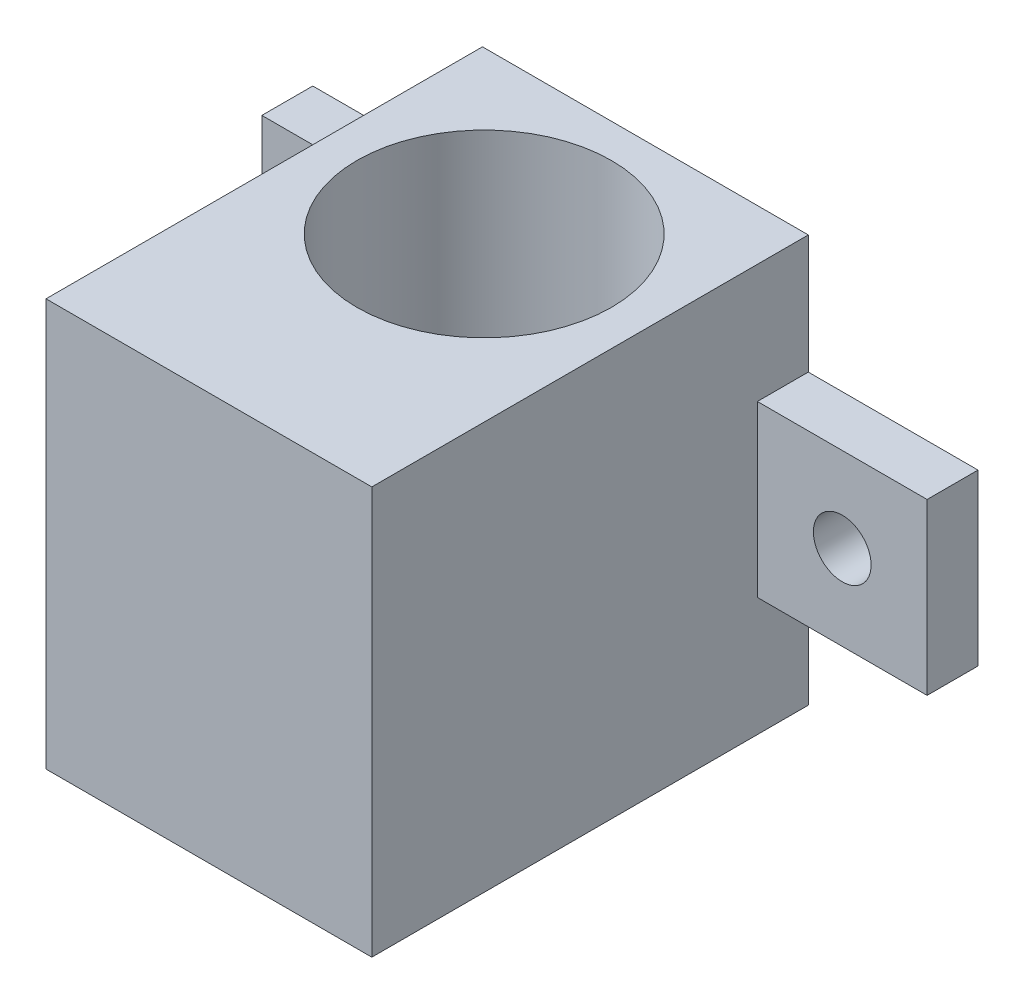
ISO-10303-21;
HEADER;
FILE_DESCRIPTION(('STEP AP214'),'2;1');
FILE_NAME('part.step','',(''),(''),'','','');
FILE_SCHEMA(('AUTOMOTIVE_DESIGN { 1 0 10303 214 1 1 1 1 }'));
ENDSEC;
DATA;
#1=APPLICATION_CONTEXT('core data for automotive mechanical design processes');
#2=APPLICATION_PROTOCOL_DEFINITION('international standard','automotive_design',2000,#1);
#3=PRODUCT_CONTEXT('',#1,'mechanical');
#4=PRODUCT('Part','Part','',(#3));
#5=PRODUCT_RELATED_PRODUCT_CATEGORY('part','',(#4));
#6=PRODUCT_DEFINITION_FORMATION('','',#4);
#7=PRODUCT_DEFINITION_CONTEXT('part definition',#1,'design');
#8=PRODUCT_DEFINITION('design','',#6,#7);
#9=PRODUCT_DEFINITION_SHAPE('','',#8);
#10=(LENGTH_UNIT() NAMED_UNIT(*) SI_UNIT(.MILLI.,.METRE.));
#11=(NAMED_UNIT(*) PLANE_ANGLE_UNIT() SI_UNIT($,.RADIAN.));
#12=(NAMED_UNIT(*) SI_UNIT($,.STERADIAN.) SOLID_ANGLE_UNIT());
#13=UNCERTAINTY_MEASURE_WITH_UNIT(LENGTH_MEASURE(1.E-05),#10,'distance_accuracy_value','');
#14=(GEOMETRIC_REPRESENTATION_CONTEXT(3) GLOBAL_UNCERTAINTY_ASSIGNED_CONTEXT((#13)) GLOBAL_UNIT_ASSIGNED_CONTEXT((#10,
#11,#12)) REPRESENTATION_CONTEXT('',''));
#15=CARTESIAN_POINT('',(0.,0.,0.));
#16=DIRECTION('',(0.,0.,1.));
#17=DIRECTION('',(1.,0.,0.));
#18=AXIS2_PLACEMENT_3D('',#15,#16,#17);
#19=CARTESIAN_POINT('',(0.,0.,3000.00000000004));
#20=DIRECTION('',(0.,0.,-1.));
#21=DIRECTION('',(-1.,0.,0.));
#22=AXIS2_PLACEMENT_3D('',#19,#20,#21);
#23=PLANE('',#22);
#24=CARTESIAN_POINT('',(14600.,0.,3000.00000000004));
#25=DIRECTION('',(0.,0.,1.));
#26=DIRECTION('',(1.,0.,0.));
#27=AXIS2_PLACEMENT_3D('',#24,#25,#26);
#28=CIRCLE('',#27,1700.);
#29=CARTESIAN_POINT('',(16300.,0.,3000.00000000004));
#30=VERTEX_POINT('',#29);
#31=EDGE_CURVE('E314',#30,#30,#28,.T.);
#32=ORIENTED_EDGE('',*,*,#31,.F.);
#33=EDGE_LOOP('',(#32));
#34=FACE_BOUND('',#33,.T.);
#35=DIRECTION('',(0.,1.,0.));
#36=VECTOR('',#35,1.);
#37=CARTESIAN_POINT('',(9600.,-12000.,3000.00000000004));
#38=LINE('',#37,#36);
#39=CARTESIAN_POINT('',(9600.,-5000.,3000.00000000004));
#40=VERTEX_POINT('',#39);
#41=CARTESIAN_POINT('',(9600.,5000.,3000.00000000004));
#42=VERTEX_POINT('',#41);
#43=EDGE_CURVE('E11',#40,#42,#38,.T.);
#44=ORIENTED_EDGE('',*,*,#43,.F.);
#45=DIRECTION('',(1.,0.,0.));
#46=VECTOR('',#45,1.);
#47=CARTESIAN_POINT('',(19600.,-5000.,3000.00000000004));
#48=LINE('',#47,#46);
#49=CARTESIAN_POINT('',(19600.,-5000.,3000.00000000004));
#50=VERTEX_POINT('',#49);
#51=EDGE_CURVE('E159',#40,#50,#48,.T.);
#52=ORIENTED_EDGE('',*,*,#51,.T.);
#53=DIRECTION('',(0.,1.,0.));
#54=VECTOR('',#53,1.);
#55=CARTESIAN_POINT('',(19600.,5000.,3000.00000000004));
#56=LINE('',#55,#54);
#57=CARTESIAN_POINT('',(19600.,5000.,3000.00000000004));
#58=VERTEX_POINT('',#57);
#59=EDGE_CURVE('E131',#50,#58,#56,.T.);
#60=ORIENTED_EDGE('',*,*,#59,.T.);
#61=DIRECTION('',(-1.,0.,0.));
#62=VECTOR('',#61,1.);
#63=CARTESIAN_POINT('',(9600.,5000.,3000.00000000004));
#64=LINE('',#63,#62);
#65=EDGE_CURVE('E127',#58,#42,#64,.T.);
#66=ORIENTED_EDGE('',*,*,#65,.T.);
#67=EDGE_LOOP('',(#44,#52,#60,#66));
#68=FACE_BOUND('',#67,.T.);
#69=ADVANCED_FACE('F35',(#34,#68),#23,.F.);
#70=CARTESIAN_POINT('',(-14600.,0.,3000.00000000004));
#71=DIRECTION('',(0.,0.,1.));
#72=DIRECTION('',(1.,0.,0.));
#73=AXIS2_PLACEMENT_3D('',#70,#71,#72);
#74=CIRCLE('',#73,1700.);
#75=CARTESIAN_POINT('',(-12900.,0.,3000.00000000004));
#76=VERTEX_POINT('',#75);
#77=EDGE_CURVE('E249',#76,#76,#74,.T.);
#78=ORIENTED_EDGE('',*,*,#77,.F.);
#79=EDGE_LOOP('',(#78));
#80=FACE_BOUND('',#79,.T.);
#81=DIRECTION('',(0.,-1.,0.));
#82=VECTOR('',#81,1.);
#83=CARTESIAN_POINT('',(-9600.,-12000.,3000.00000000004));
#84=LINE('',#83,#82);
#85=CARTESIAN_POINT('',(-9600.,5000.,3000.00000000004));
#86=VERTEX_POINT('',#85);
#87=CARTESIAN_POINT('',(-9600.,-5000.,3000.00000000004));
#88=VERTEX_POINT('',#87);
#89=EDGE_CURVE('E45',#86,#88,#84,.T.);
#90=ORIENTED_EDGE('',*,*,#89,.F.);
#91=DIRECTION('',(-1.,0.,0.));
#92=VECTOR('',#91,1.);
#93=CARTESIAN_POINT('',(-19600.,5000.,3000.00000000004));
#94=LINE('',#93,#92);
#95=CARTESIAN_POINT('',(-19600.,5000.,3000.00000000004));
#96=VERTEX_POINT('',#95);
#97=EDGE_CURVE('E54',#86,#96,#94,.T.);
#98=ORIENTED_EDGE('',*,*,#97,.T.);
#99=DIRECTION('',(0.,-1.,0.));
#100=VECTOR('',#99,1.);
#101=CARTESIAN_POINT('',(-19600.,-5000.,3000.00000000004));
#102=LINE('',#101,#100);
#103=CARTESIAN_POINT('',(-19600.,-5000.,3000.00000000004));
#104=VERTEX_POINT('',#103);
#105=EDGE_CURVE('E163',#96,#104,#102,.T.);
#106=ORIENTED_EDGE('',*,*,#105,.T.);
#107=DIRECTION('',(1.,0.,0.));
#108=VECTOR('',#107,1.);
#109=CARTESIAN_POINT('',(-9600.,-5000.,3000.00000000004));
#110=LINE('',#109,#108);
#111=EDGE_CURVE('E111',#104,#88,#110,.T.);
#112=ORIENTED_EDGE('',*,*,#111,.T.);
#113=EDGE_LOOP('',(#90,#98,#106,#112));
#114=FACE_BOUND('',#113,.T.);
#115=ADVANCED_FACE('F252',(#80,#114),#23,.F.);
#116=CARTESIAN_POINT('',(0.,0.,0.));
#117=DIRECTION('',(0.,0.,-1.));
#118=DIRECTION('',(-1.,0.,0.));
#119=AXIS2_PLACEMENT_3D('',#116,#117,#118);
#120=PLANE('',#119);
#121=CARTESIAN_POINT('',(-14600.,0.,0.));
#122=DIRECTION('',(0.,0.,1.));
#123=DIRECTION('',(1.,0.,0.));
#124=AXIS2_PLACEMENT_3D('',#121,#122,#123);
#125=CIRCLE('',#124,1700.);
#126=CARTESIAN_POINT('',(-12900.,0.,0.));
#127=VERTEX_POINT('',#126);
#128=EDGE_CURVE('E245',#127,#127,#125,.T.);
#129=ORIENTED_EDGE('',*,*,#128,.T.);
#130=EDGE_LOOP('',(#129));
#131=FACE_BOUND('',#130,.T.);
#132=DIRECTION('',(0.,-1.,0.));
#133=VECTOR('',#132,1.);
#134=CARTESIAN_POINT('',(-19600.,-5000.,0.));
#135=LINE('',#134,#133);
#136=CARTESIAN_POINT('',(-19600.,5000.,0.));
#137=VERTEX_POINT('',#136);
#138=CARTESIAN_POINT('',(-19600.,-5000.,0.));
#139=VERTEX_POINT('',#138);
#140=EDGE_CURVE('E248',#137,#139,#135,.T.);
#141=ORIENTED_EDGE('',*,*,#140,.F.);
#142=DIRECTION('',(-1.,0.,0.));
#143=VECTOR('',#142,1.);
#144=CARTESIAN_POINT('',(-19600.,5000.,0.));
#145=LINE('',#144,#143);
#146=CARTESIAN_POINT('',(-9600.,5000.,0.));
#147=VERTEX_POINT('',#146);
#148=EDGE_CURVE('E102',#147,#137,#145,.T.);
#149=ORIENTED_EDGE('',*,*,#148,.F.);
#150=DIRECTION('',(0.,-1.,0.));
#151=VECTOR('',#150,1.);
#152=CARTESIAN_POINT('',(-9600.,5000.,0.));
#153=LINE('',#152,#151);
#154=CARTESIAN_POINT('',(-9600.,12000.,0.));
#155=VERTEX_POINT('',#154);
#156=EDGE_CURVE('E96',#155,#147,#153,.T.);
#157=ORIENTED_EDGE('',*,*,#156,.F.);
#158=DIRECTION('',(-1.,0.,0.));
#159=VECTOR('',#158,1.);
#160=CARTESIAN_POINT('',(-9600.,12000.,0.));
#161=LINE('',#160,#159);
#162=CARTESIAN_POINT('',(9600.,12000.,0.));
#163=VERTEX_POINT('',#162);
#164=EDGE_CURVE('E241',#163,#155,#161,.T.);
#165=ORIENTED_EDGE('',*,*,#164,.F.);
#166=DIRECTION('',(0.,1.,0.));
#167=VECTOR('',#166,1.);
#168=CARTESIAN_POINT('',(9600.,12000.,0.));
#169=LINE('',#168,#167);
#170=CARTESIAN_POINT('',(9600.,5000.,0.));
#171=VERTEX_POINT('',#170);
#172=EDGE_CURVE('E239',#171,#163,#169,.T.);
#173=ORIENTED_EDGE('',*,*,#172,.F.);
#174=DIRECTION('',(-1.,0.,0.));
#175=VECTOR('',#174,1.);
#176=CARTESIAN_POINT('',(9600.,5000.,0.));
#177=LINE('',#176,#175);
#178=CARTESIAN_POINT('',(19600.,5000.,0.));
#179=VERTEX_POINT('',#178);
#180=EDGE_CURVE('E140',#179,#171,#177,.T.);
#181=ORIENTED_EDGE('',*,*,#180,.F.);
#182=DIRECTION('',(0.,1.,0.));
#183=VECTOR('',#182,1.);
#184=CARTESIAN_POINT('',(19600.,5000.,0.));
#185=LINE('',#184,#183);
#186=CARTESIAN_POINT('',(19600.,-5000.,0.));
#187=VERTEX_POINT('',#186);
#188=EDGE_CURVE('E236',#187,#179,#185,.T.);
#189=ORIENTED_EDGE('',*,*,#188,.F.);
#190=DIRECTION('',(1.,0.,0.));
#191=VECTOR('',#190,1.);
#192=CARTESIAN_POINT('',(19600.,-5000.,0.));
#193=LINE('',#192,#191);
#194=CARTESIAN_POINT('',(9600.,-5000.,0.));
#195=VERTEX_POINT('',#194);
#196=EDGE_CURVE('E229',#195,#187,#193,.T.);
#197=ORIENTED_EDGE('',*,*,#196,.F.);
#198=DIRECTION('',(0.,1.,0.));
#199=VECTOR('',#198,1.);
#200=CARTESIAN_POINT('',(9600.,-5000.,0.));
#201=LINE('',#200,#199);
#202=CARTESIAN_POINT('',(9600.,-12000.,0.));
#203=VERTEX_POINT('',#202);
#204=EDGE_CURVE('E152',#203,#195,#201,.T.);
#205=ORIENTED_EDGE('',*,*,#204,.F.);
#206=DIRECTION('',(1.,0.,0.));
#207=VECTOR('',#206,1.);
#208=CARTESIAN_POINT('',(9600.,-12000.,0.));
#209=LINE('',#208,#207);
#210=CARTESIAN_POINT('',(-9600.,-12000.,0.));
#211=VERTEX_POINT('',#210);
#212=EDGE_CURVE('E217',#211,#203,#209,.T.);
#213=ORIENTED_EDGE('',*,*,#212,.F.);
#214=DIRECTION('',(0.,-1.,0.));
#215=VECTOR('',#214,1.);
#216=CARTESIAN_POINT('',(-9600.,-12000.,0.));
#217=LINE('',#216,#215);
#218=CARTESIAN_POINT('',(-9600.,-5000.,0.));
#219=VERTEX_POINT('',#218);
#220=EDGE_CURVE('E227',#219,#211,#217,.T.);
#221=ORIENTED_EDGE('',*,*,#220,.F.);
#222=DIRECTION('',(1.,0.,0.));
#223=VECTOR('',#222,1.);
#224=CARTESIAN_POINT('',(-9600.,-5000.,0.));
#225=LINE('',#224,#223);
#226=EDGE_CURVE('E231',#139,#219,#225,.T.);
#227=ORIENTED_EDGE('',*,*,#226,.F.);
#228=EDGE_LOOP('',(#141,#149,#157,#165,#173,#181,#189,#197,#205,#213,#221,#227));
#229=FACE_BOUND('',#228,.T.);
#230=CARTESIAN_POINT('',(14600.,0.,0.));
#231=DIRECTION('',(0.,0.,1.));
#232=DIRECTION('',(1.,0.,0.));
#233=AXIS2_PLACEMENT_3D('',#230,#231,#232);
#234=CIRCLE('',#233,1700.);
#235=CARTESIAN_POINT('',(16300.,0.,0.));
#236=VERTEX_POINT('',#235);
#237=EDGE_CURVE('E308',#236,#236,#234,.T.);
#238=ORIENTED_EDGE('',*,*,#237,.T.);
#239=EDGE_LOOP('',(#238));
#240=FACE_BOUND('',#239,.T.);
#241=ADVANCED_FACE('F225',(#131,#229,#240),#120,.T.);
#242=CARTESIAN_POINT('',(-19600.,-5000.,3000.00000000004));
#243=DIRECTION('',(1.,0.,0.));
#244=DIRECTION('',(0.,0.,-1.));
#245=AXIS2_PLACEMENT_3D('',#242,#243,#244);
#246=PLANE('',#245);
#247=ORIENTED_EDGE('',*,*,#140,.T.);
#248=DIRECTION('',(0.,0.,-1.));
#249=VECTOR('',#248,1.);
#250=CARTESIAN_POINT('',(-19600.,-5000.,3000.00000000004));
#251=LINE('',#250,#249);
#252=EDGE_CURVE('E178',#104,#139,#251,.T.);
#253=ORIENTED_EDGE('',*,*,#252,.F.);
#254=ORIENTED_EDGE('',*,*,#105,.F.);
#255=DIRECTION('',(0.,0.,-1.));
#256=VECTOR('',#255,1.);
#257=CARTESIAN_POINT('',(-19600.,5000.,3000.00000000004));
#258=LINE('',#257,#256);
#259=EDGE_CURVE('E195',#96,#137,#258,.T.);
#260=ORIENTED_EDGE('',*,*,#259,.T.);
#261=EDGE_LOOP('',(#247,#253,#254,#260));
#262=FACE_BOUND('',#261,.T.);
#263=ADVANCED_FACE('F37',(#262),#246,.F.);
#264=CARTESIAN_POINT('',(-9600.,-5000.,3000.00000000004));
#265=DIRECTION('',(0.,1.,0.));
#266=DIRECTION('',(-1.,0.,0.));
#267=AXIS2_PLACEMENT_3D('',#264,#265,#266);
#268=PLANE('',#267);
#269=ORIENTED_EDGE('',*,*,#226,.T.);
#270=DIRECTION('',(0.,0.,-1.));
#271=VECTOR('',#270,1.);
#272=CARTESIAN_POINT('',(-9600.,-5000.,3000.00000000004));
#273=LINE('',#272,#271);
#274=EDGE_CURVE('E186',#88,#219,#273,.T.);
#275=ORIENTED_EDGE('',*,*,#274,.F.);
#276=ORIENTED_EDGE('',*,*,#111,.F.);
#277=ORIENTED_EDGE('',*,*,#252,.T.);
#278=EDGE_LOOP('',(#269,#275,#276,#277));
#279=FACE_BOUND('',#278,.T.);
#280=ADVANCED_FACE('F250',(#279),#268,.F.);
#281=CARTESIAN_POINT('',(9600.,-12000.,3000.00000000004));
#282=DIRECTION('',(0.,1.,0.));
#283=DIRECTION('',(-1.,0.,0.));
#284=AXIS2_PLACEMENT_3D('',#281,#282,#283);
#285=PLANE('',#284);
#286=CARTESIAN_POINT('',(1.11022302462516E-12,-12000.,9500.));
#287=DIRECTION('',(0.,-1.,0.));
#288=DIRECTION('',(1.,0.,0.));
#289=AXIS2_PLACEMENT_3D('',#286,#287,#288);
#290=CIRCLE('',#289,7500.);
#291=CARTESIAN_POINT('',(7500.,-12000.,9500.));
#292=VERTEX_POINT('',#291);
#293=EDGE_CURVE('E347',#292,#292,#290,.T.);
#294=ORIENTED_EDGE('',*,*,#293,.F.);
#295=EDGE_LOOP('',(#294));
#296=FACE_BOUND('',#295,.T.);
#297=ORIENTED_EDGE('',*,*,#212,.T.);
#298=DIRECTION('',(0.,0.,-1.));
#299=VECTOR('',#298,1.);
#300=CARTESIAN_POINT('',(9600.,-12000.,3000.00000000004));
#301=LINE('',#300,#299);
#302=CARTESIAN_POINT('',(9600.,-12000.,25720.));
#303=VERTEX_POINT('',#302);
#304=EDGE_CURVE('E155',#303,#203,#301,.T.);
#305=ORIENTED_EDGE('',*,*,#304,.F.);
#306=DIRECTION('',(1.,0.,0.));
#307=VECTOR('',#306,1.);
#308=CARTESIAN_POINT('',(9600.,-12000.,25720.));
#309=LINE('',#308,#307);
#310=CARTESIAN_POINT('',(-9600.,-12000.,25720.));
#311=VERTEX_POINT('',#310);
#312=EDGE_CURVE('E220',#311,#303,#309,.T.);
#313=ORIENTED_EDGE('',*,*,#312,.F.);
#314=DIRECTION('',(0.,0.,-1.));
#315=VECTOR('',#314,1.);
#316=CARTESIAN_POINT('',(-9600.,-12000.,3000.00000000004));
#317=LINE('',#316,#315);
#318=EDGE_CURVE('E189',#311,#211,#317,.T.);
#319=ORIENTED_EDGE('',*,*,#318,.T.);
#320=EDGE_LOOP('',(#297,#305,#313,#319));
#321=FACE_BOUND('',#320,.T.);
#322=ADVANCED_FACE('F215',(#296,#321),#285,.F.);
#323=CARTESIAN_POINT('',(19600.,-5000.,3000.00000000004));
#324=DIRECTION('',(0.,1.,0.));
#325=DIRECTION('',(-1.,0.,0.));
#326=AXIS2_PLACEMENT_3D('',#323,#324,#325);
#327=PLANE('',#326);
#328=ORIENTED_EDGE('',*,*,#196,.T.);
#329=DIRECTION('',(0.,0.,-1.));
#330=VECTOR('',#329,1.);
#331=CARTESIAN_POINT('',(19600.,-5000.,3000.00000000004));
#332=LINE('',#331,#330);
#333=EDGE_CURVE('E156',#50,#187,#332,.T.);
#334=ORIENTED_EDGE('',*,*,#333,.F.);
#335=ORIENTED_EDGE('',*,*,#51,.F.);
#336=DIRECTION('',(0.,0.,-1.));
#337=VECTOR('',#336,1.);
#338=CARTESIAN_POINT('',(9600.,-5000.,3000.00000000004));
#339=LINE('',#338,#337);
#340=EDGE_CURVE('E148',#40,#195,#339,.T.);
#341=ORIENTED_EDGE('',*,*,#340,.T.);
#342=EDGE_LOOP('',(#328,#334,#335,#341));
#343=FACE_BOUND('',#342,.T.);
#344=ADVANCED_FACE('F160',(#343),#327,.F.);
#345=CARTESIAN_POINT('',(19600.,5000.,3000.00000000004));
#346=DIRECTION('',(-1.,0.,0.));
#347=DIRECTION('',(0.,0.,1.));
#348=AXIS2_PLACEMENT_3D('',#345,#346,#347);
#349=PLANE('',#348);
#350=ORIENTED_EDGE('',*,*,#188,.T.);
#351=DIRECTION('',(0.,0.,-1.));
#352=VECTOR('',#351,1.);
#353=CARTESIAN_POINT('',(19600.,5000.,3000.00000000004));
#354=LINE('',#353,#352);
#355=EDGE_CURVE('E143',#58,#179,#354,.T.);
#356=ORIENTED_EDGE('',*,*,#355,.F.);
#357=ORIENTED_EDGE('',*,*,#59,.F.);
#358=ORIENTED_EDGE('',*,*,#333,.T.);
#359=EDGE_LOOP('',(#350,#356,#357,#358));
#360=FACE_BOUND('',#359,.T.);
#361=ADVANCED_FACE('F281',(#360),#349,.F.);
#362=CARTESIAN_POINT('',(9600.,5000.,3000.00000000004));
#363=DIRECTION('',(0.,-1.,0.));
#364=DIRECTION('',(0.,0.,-1.));
#365=AXIS2_PLACEMENT_3D('',#362,#363,#364);
#366=PLANE('',#365);
#367=ORIENTED_EDGE('',*,*,#180,.T.);
#368=DIRECTION('',(0.,0.,-1.));
#369=VECTOR('',#368,1.);
#370=CARTESIAN_POINT('',(9600.,5000.,3000.00000000004));
#371=LINE('',#370,#369);
#372=EDGE_CURVE('E137',#42,#171,#371,.T.);
#373=ORIENTED_EDGE('',*,*,#372,.F.);
#374=ORIENTED_EDGE('',*,*,#65,.F.);
#375=ORIENTED_EDGE('',*,*,#355,.T.);
#376=EDGE_LOOP('',(#367,#373,#374,#375));
#377=FACE_BOUND('',#376,.T.);
#378=ADVANCED_FACE('F138',(#377),#366,.F.);
#379=CARTESIAN_POINT('',(9600.,12000.,3000.00000000004));
#380=DIRECTION('',(-1.,0.,0.));
#381=DIRECTION('',(0.,0.,1.));
#382=AXIS2_PLACEMENT_3D('',#379,#380,#381);
#383=PLANE('',#382);
#384=ORIENTED_EDGE('',*,*,#172,.T.);
#385=DIRECTION('',(0.,0.,-1.));
#386=VECTOR('',#385,1.);
#387=CARTESIAN_POINT('',(9600.,12000.,3000.00000000004));
#388=LINE('',#387,#386);
#389=CARTESIAN_POINT('',(9600.,12000.,25720.));
#390=VERTEX_POINT('',#389);
#391=EDGE_CURVE('E144',#390,#163,#388,.T.);
#392=ORIENTED_EDGE('',*,*,#391,.F.);
#393=DIRECTION('',(0.,1.,0.));
#394=VECTOR('',#393,1.);
#395=CARTESIAN_POINT('',(9600.,-12000.,25720.));
#396=LINE('',#395,#394);
#397=EDGE_CURVE('E310',#303,#390,#396,.T.);
#398=ORIENTED_EDGE('',*,*,#397,.F.);
#399=ORIENTED_EDGE('',*,*,#304,.T.);
#400=ORIENTED_EDGE('',*,*,#204,.T.);
#401=ORIENTED_EDGE('',*,*,#340,.F.);
#402=ORIENTED_EDGE('',*,*,#43,.T.);
#403=ORIENTED_EDGE('',*,*,#372,.T.);
#404=EDGE_LOOP('',(#384,#392,#398,#399,#400,#401,#402,#403));
#405=FACE_BOUND('',#404,.T.);
#406=ADVANCED_FACE('F146',(#405),#383,.F.);
#407=CARTESIAN_POINT('',(-9600.,12000.,3000.00000000004));
#408=DIRECTION('',(0.,-1.,0.));
#409=DIRECTION('',(0.,0.,-1.));
#410=AXIS2_PLACEMENT_3D('',#407,#408,#409);
#411=PLANE('',#410);
#412=CARTESIAN_POINT('',(-1.11022302462516E-12,12000.,9500.));
#413=DIRECTION('',(0.,-1.,0.));
#414=DIRECTION('',(1.,0.,0.));
#415=AXIS2_PLACEMENT_3D('',#412,#413,#414);
#416=CIRCLE('',#415,7500.);
#417=CARTESIAN_POINT('',(7500.,12000.,9500.));
#418=VERTEX_POINT('',#417);
#419=EDGE_CURVE('E344',#418,#418,#416,.T.);
#420=ORIENTED_EDGE('',*,*,#419,.T.);
#421=EDGE_LOOP('',(#420));
#422=FACE_BOUND('',#421,.T.);
#423=ORIENTED_EDGE('',*,*,#164,.T.);
#424=DIRECTION('',(0.,0.,-1.));
#425=VECTOR('',#424,1.);
#426=CARTESIAN_POINT('',(-9600.,12000.,3000.00000000004));
#427=LINE('',#426,#425);
#428=CARTESIAN_POINT('',(-9600.,12000.,25720.));
#429=VERTEX_POINT('',#428);
#430=EDGE_CURVE('E194',#429,#155,#427,.T.);
#431=ORIENTED_EDGE('',*,*,#430,.F.);
#432=DIRECTION('',(-1.,0.,0.));
#433=VECTOR('',#432,1.);
#434=CARTESIAN_POINT('',(9600.,12000.,25720.));
#435=LINE('',#434,#433);
#436=EDGE_CURVE('E306',#390,#429,#435,.T.);
#437=ORIENTED_EDGE('',*,*,#436,.F.);
#438=ORIENTED_EDGE('',*,*,#391,.T.);
#439=EDGE_LOOP('',(#423,#431,#437,#438));
#440=FACE_BOUND('',#439,.T.);
#441=ADVANCED_FACE('F273',(#422,#440),#411,.F.);
#442=CARTESIAN_POINT('',(-9600.,5000.,3000.00000000004));
#443=DIRECTION('',(1.,0.,0.));
#444=DIRECTION('',(0.,0.,-1.));
#445=AXIS2_PLACEMENT_3D('',#442,#443,#444);
#446=PLANE('',#445);
#447=ORIENTED_EDGE('',*,*,#156,.T.);
#448=DIRECTION('',(0.,0.,-1.));
#449=VECTOR('',#448,1.);
#450=CARTESIAN_POINT('',(-9600.,5000.,3000.00000000004));
#451=LINE('',#450,#449);
#452=EDGE_CURVE('E192',#86,#147,#451,.T.);
#453=ORIENTED_EDGE('',*,*,#452,.F.);
#454=ORIENTED_EDGE('',*,*,#89,.T.);
#455=ORIENTED_EDGE('',*,*,#274,.T.);
#456=ORIENTED_EDGE('',*,*,#220,.T.);
#457=ORIENTED_EDGE('',*,*,#318,.F.);
#458=DIRECTION('',(0.,-1.,0.));
#459=VECTOR('',#458,1.);
#460=CARTESIAN_POINT('',(-9600.,-12000.,25720.));
#461=LINE('',#460,#459);
#462=EDGE_CURVE('E302',#429,#311,#461,.T.);
#463=ORIENTED_EDGE('',*,*,#462,.F.);
#464=ORIENTED_EDGE('',*,*,#430,.T.);
#465=EDGE_LOOP('',(#447,#453,#454,#455,#456,#457,#463,#464));
#466=FACE_BOUND('',#465,.T.);
#467=ADVANCED_FACE('F251',(#466),#446,.F.);
#468=CARTESIAN_POINT('',(-19600.,5000.,3000.00000000004));
#469=DIRECTION('',(0.,-1.,0.));
#470=DIRECTION('',(0.,0.,-1.));
#471=AXIS2_PLACEMENT_3D('',#468,#469,#470);
#472=PLANE('',#471);
#473=ORIENTED_EDGE('',*,*,#148,.T.);
#474=ORIENTED_EDGE('',*,*,#259,.F.);
#475=ORIENTED_EDGE('',*,*,#97,.F.);
#476=ORIENTED_EDGE('',*,*,#452,.T.);
#477=EDGE_LOOP('',(#473,#474,#475,#476));
#478=FACE_BOUND('',#477,.T.);
#479=ADVANCED_FACE('F268',(#478),#472,.F.);
#480=CARTESIAN_POINT('',(-14600.,0.,3000.00000000004));
#481=DIRECTION('',(0.,0.,-1.));
#482=DIRECTION('',(-1.,0.,0.));
#483=AXIS2_PLACEMENT_3D('',#480,#481,#482);
#484=CYLINDRICAL_SURFACE('',#483,1700.);
#485=ORIENTED_EDGE('',*,*,#77,.T.);
#486=EDGE_LOOP('',(#485));
#487=FACE_BOUND('',#486,.T.);
#488=ORIENTED_EDGE('',*,*,#128,.F.);
#489=EDGE_LOOP('',(#488));
#490=FACE_BOUND('',#489,.T.);
#491=ADVANCED_FACE('F265',(#487,#490),#484,.F.);
#492=CARTESIAN_POINT('',(14600.,0.,3000.00000000004));
#493=DIRECTION('',(0.,0.,-1.));
#494=DIRECTION('',(-1.,0.,0.));
#495=AXIS2_PLACEMENT_3D('',#492,#493,#494);
#496=CYLINDRICAL_SURFACE('',#495,1700.);
#497=ORIENTED_EDGE('',*,*,#31,.T.);
#498=EDGE_LOOP('',(#497));
#499=FACE_BOUND('',#498,.T.);
#500=ORIENTED_EDGE('',*,*,#237,.F.);
#501=EDGE_LOOP('',(#500));
#502=FACE_BOUND('',#501,.T.);
#503=ADVANCED_FACE('F324',(#499,#502),#496,.F.);
#504=CARTESIAN_POINT('',(0.,0.,25720.));
#505=DIRECTION('',(0.,0.,1.));
#506=DIRECTION('',(1.,0.,0.));
#507=AXIS2_PLACEMENT_3D('',#504,#505,#506);
#508=PLANE('',#507);
#509=ORIENTED_EDGE('',*,*,#397,.T.);
#510=ORIENTED_EDGE('',*,*,#436,.T.);
#511=ORIENTED_EDGE('',*,*,#462,.T.);
#512=ORIENTED_EDGE('',*,*,#312,.T.);
#513=EDGE_LOOP('',(#509,#510,#511,#512));
#514=FACE_BOUND('',#513,.T.);
#515=ADVANCED_FACE('F328',(#514),#508,.T.);
#516=CARTESIAN_POINT('',(-1.11022302462516E-12,12000.,9500.));
#517=DIRECTION('',(0.,-1.,0.));
#518=DIRECTION('',(1.,0.,0.));
#519=AXIS2_PLACEMENT_3D('',#516,#517,#518);
#520=CYLINDRICAL_SURFACE('',#519,7500.);
#521=CARTESIAN_POINT('',(7500.,12000.,9500.));
#522=CARTESIAN_POINT('',(7500.,11750.,9500.));
#523=CARTESIAN_POINT('',(7500.,11500.,9500.));
#524=CARTESIAN_POINT('',(7500.,11000.,9500.));
#525=CARTESIAN_POINT('',(7500.,10750.,9500.));
#526=CARTESIAN_POINT('',(7500.,10250.,9500.));
#527=CARTESIAN_POINT('',(7500.,10000.,9500.));
#528=CARTESIAN_POINT('',(7500.,9500.,9500.));
#529=CARTESIAN_POINT('',(7500.,9250.,9500.));
#530=CARTESIAN_POINT('',(7500.,8750.,9500.));
#531=CARTESIAN_POINT('',(7500.,8500.,9500.));
#532=CARTESIAN_POINT('',(7500.,8000.,9500.));
#533=CARTESIAN_POINT('',(7500.,7750.,9500.));
#534=CARTESIAN_POINT('',(7500.,7250.,9500.));
#535=CARTESIAN_POINT('',(7500.,7000.,9500.));
#536=CARTESIAN_POINT('',(7500.,6500.,9500.));
#537=CARTESIAN_POINT('',(7500.,6250.,9500.));
#538=CARTESIAN_POINT('',(7500.,5750.,9500.));
#539=CARTESIAN_POINT('',(7500.,5500.,9500.));
#540=CARTESIAN_POINT('',(7500.,5000.,9500.));
#541=CARTESIAN_POINT('',(7500.,4750.,9500.));
#542=CARTESIAN_POINT('',(7500.,4250.,9500.));
#543=CARTESIAN_POINT('',(7500.,4000.,9500.));
#544=CARTESIAN_POINT('',(7500.,3500.00000000001,9500.));
#545=CARTESIAN_POINT('',(7500.,3250.,9500.));
#546=CARTESIAN_POINT('',(7500.,2750.,9500.));
#547=CARTESIAN_POINT('',(7500.,2500.,9500.));
#548=CARTESIAN_POINT('',(7500.,2000.,9500.));
#549=CARTESIAN_POINT('',(7500.,1750.,9500.));
#550=CARTESIAN_POINT('',(7500.,1250.,9500.));
#551=CARTESIAN_POINT('',(7500.,1000.,9500.));
#552=CARTESIAN_POINT('',(7500.,500.000000000004,9500.));
#553=CARTESIAN_POINT('',(7500.,250.000000000004,9500.));
#554=CARTESIAN_POINT('',(7500.,-249.999999999996,9500.));
#555=CARTESIAN_POINT('',(7500.,-499.999999999996,9500.));
#556=CARTESIAN_POINT('',(7500.,-999.999999999996,9500.));
#557=CARTESIAN_POINT('',(7500.,-1250.,9500.));
#558=CARTESIAN_POINT('',(7500.,-1750.,9500.));
#559=CARTESIAN_POINT('',(7500.,-2000.,9500.));
#560=CARTESIAN_POINT('',(7500.,-2500.,9500.));
#561=CARTESIAN_POINT('',(7500.,-2750.,9500.));
#562=CARTESIAN_POINT('',(7500.,-3250.,9500.));
#563=CARTESIAN_POINT('',(7500.,-3500.,9500.));
#564=CARTESIAN_POINT('',(7500.,-4000.,9500.));
#565=CARTESIAN_POINT('',(7500.,-4250.,9500.));
#566=CARTESIAN_POINT('',(7500.,-4750.,9500.));
#567=CARTESIAN_POINT('',(7500.,-5000.,9500.));
#568=CARTESIAN_POINT('',(7500.,-5500.,9500.));
#569=CARTESIAN_POINT('',(7500.,-5750.,9500.));
#570=CARTESIAN_POINT('',(7500.,-6250.,9500.));
#571=CARTESIAN_POINT('',(7500.,-6500.,9500.));
#572=CARTESIAN_POINT('',(7500.,-7000.,9500.));
#573=CARTESIAN_POINT('',(7500.,-7250.,9500.));
#574=CARTESIAN_POINT('',(7500.,-7750.,9500.));
#575=CARTESIAN_POINT('',(7500.,-8000.,9500.));
#576=CARTESIAN_POINT('',(7500.,-8500.,9500.));
#577=CARTESIAN_POINT('',(7500.,-8750.,9500.));
#578=CARTESIAN_POINT('',(7500.,-9250.,9500.));
#579=CARTESIAN_POINT('',(7500.,-9500.,9500.));
#580=CARTESIAN_POINT('',(7500.,-10000.,9500.));
#581=CARTESIAN_POINT('',(7500.,-10250.,9500.));
#582=CARTESIAN_POINT('',(7500.,-10750.,9500.));
#583=CARTESIAN_POINT('',(7500.,-11000.,9500.));
#584=CARTESIAN_POINT('',(7500.,-11500.,9500.));
#585=CARTESIAN_POINT('',(7500.,-11750.,9500.));
#586=CARTESIAN_POINT('',(7500.,-12000.,9500.));
#587=B_SPLINE_CURVE_WITH_KNOTS('',3,(#521,#522,#523,#524,#525,#526,#527,#528,#529,#530,#531,
#532,#533,#534,#535,#536,#537,#538,#539,#540,#541,#542,#543,#544,#545,#546,#547,#548,#549,#550,
#551,#552,#553,#554,#555,#556,#557,#558,#559,#560,#561,#562,#563,#564,#565,#566,#567,#568,#569,
#570,#571,#572,#573,#574,#575,#576,#577,#578,#579,#580,#581,#582,#583,#584,#585,#586),
.UNSPECIFIED.,.F.,.F.,(4,2,2,2,2,2,2,2,2,2,2,2,2,2,2,2,2,2,2,2,2,2,2,2,2,2,2,2,2,2,2,2,4),(0.,
750.000000000002,1500.,2250.,3000.,3750.,4500.,5250.,6000.,6750.,7500.,8250.,9000.,9750.,10500.,
11250.,12000.,12750.,13500.,14250.,15000.,15750.,16500.,17250.,18000.,18750.,19500.,20250.,
21000.,21750.,22500.,23250.,24000.),.UNSPECIFIED.);
#588=EDGE_CURVE('BSEAM333',#418,#292,#587,.T.);
#589=ORIENTED_EDGE('',*,*,#419,.F.);
#590=ORIENTED_EDGE('',*,*,#293,.T.);
#591=ORIENTED_EDGE('',*,*,#588,.T.);
#592=ORIENTED_EDGE('',*,*,#588,.F.);
#593=EDGE_LOOP('',(#589,#591,#590,#592));
#594=FACE_BOUND('',#593,.T.);
#595=ADVANCED_FACE('F333',(#594),#520,.F.);
#596=CLOSED_SHELL('',(#69,#115,#241,#263,#280,#322,#344,#361,#378,#406,#441,#467,#479,#491,#503,
#515,#595));
#597=MANIFOLD_SOLID_BREP('B2',#596);
#598=ADVANCED_BREP_SHAPE_REPRESENTATION('',(#18,#597),#14);
#599=SHAPE_DEFINITION_REPRESENTATION(#9,#598);
ENDSEC;
END-ISO-10303-21;
